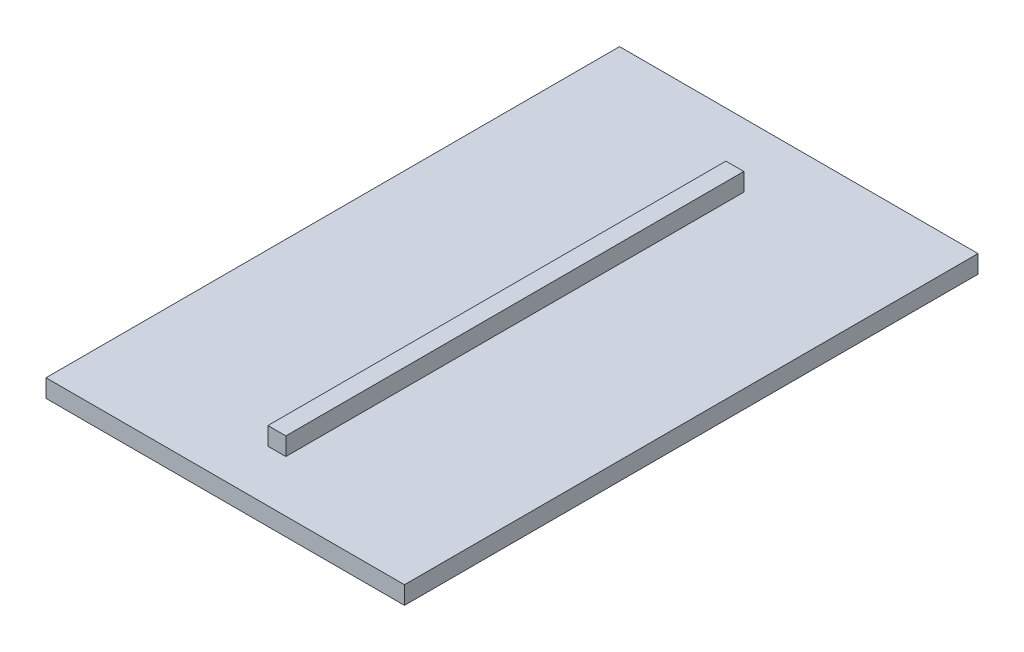
ISO-10303-21;
HEADER;
FILE_DESCRIPTION(('STEP AP214'),'2;1');
FILE_NAME('part.step','',(''),(''),'','','');
FILE_SCHEMA(('AUTOMOTIVE_DESIGN { 1 0 10303 214 1 1 1 1 }'));
ENDSEC;
DATA;
#1=APPLICATION_CONTEXT('core data for automotive mechanical design processes');
#2=APPLICATION_PROTOCOL_DEFINITION('international standard','automotive_design',2000,#1);
#3=PRODUCT_CONTEXT('',#1,'mechanical');
#4=PRODUCT('Part','Part','',(#3));
#5=PRODUCT_RELATED_PRODUCT_CATEGORY('part','',(#4));
#6=PRODUCT_DEFINITION_FORMATION('','',#4);
#7=PRODUCT_DEFINITION_CONTEXT('part definition',#1,'design');
#8=PRODUCT_DEFINITION('design','',#6,#7);
#9=PRODUCT_DEFINITION_SHAPE('','',#8);
#10=(LENGTH_UNIT() NAMED_UNIT(*) SI_UNIT(.MILLI.,.METRE.));
#11=(NAMED_UNIT(*) PLANE_ANGLE_UNIT() SI_UNIT($,.RADIAN.));
#12=(NAMED_UNIT(*) SI_UNIT($,.STERADIAN.) SOLID_ANGLE_UNIT());
#13=UNCERTAINTY_MEASURE_WITH_UNIT(LENGTH_MEASURE(1.E-05),#10,'distance_accuracy_value','');
#14=(GEOMETRIC_REPRESENTATION_CONTEXT(3) GLOBAL_UNCERTAINTY_ASSIGNED_CONTEXT((#13)) GLOBAL_UNIT_ASSIGNED_CONTEXT((#10,
#11,#12)) REPRESENTATION_CONTEXT('',''));
#15=CARTESIAN_POINT('',(0.,0.,0.));
#16=DIRECTION('',(0.,0.,1.));
#17=DIRECTION('',(1.,0.,0.));
#18=AXIS2_PLACEMENT_3D('',#15,#16,#17);
#19=CARTESIAN_POINT('',(0.,0.5,0.));
#20=DIRECTION('',(0.,1.,0.));
#21=DIRECTION('',(0.,0.,1.));
#22=AXIS2_PLACEMENT_3D('',#19,#20,#21);
#23=PLANE('',#22);
#24=DIRECTION('',(0.,0.,-1.));
#25=VECTOR('',#24,1.);
#26=CARTESIAN_POINT('',(5.,0.5,-8.));
#27=LINE('',#26,#25);
#28=CARTESIAN_POINT('',(5.,0.5,8.));
#29=VERTEX_POINT('',#28);
#30=CARTESIAN_POINT('',(5.,0.5,-8.));
#31=VERTEX_POINT('',#30);
#32=EDGE_CURVE('E142',#29,#31,#27,.T.);
#33=ORIENTED_EDGE('',*,*,#32,.T.);
#34=DIRECTION('',(-1.,0.,0.));
#35=VECTOR('',#34,1.);
#36=CARTESIAN_POINT('',(-5.,0.5,-8.));
#37=LINE('',#36,#35);
#38=CARTESIAN_POINT('',(-5.,0.5,-8.));
#39=VERTEX_POINT('',#38);
#40=EDGE_CURVE('E87',#31,#39,#37,.T.);
#41=ORIENTED_EDGE('',*,*,#40,.T.);
#42=DIRECTION('',(0.,0.,1.));
#43=VECTOR('',#42,1.);
#44=CARTESIAN_POINT('',(-5.,0.5,-8.));
#45=LINE('',#44,#43);
#46=CARTESIAN_POINT('',(-5.,0.5,8.));
#47=VERTEX_POINT('',#46);
#48=EDGE_CURVE('E145',#39,#47,#45,.T.);
#49=ORIENTED_EDGE('',*,*,#48,.T.);
#50=DIRECTION('',(1.,0.,0.));
#51=VECTOR('',#50,1.);
#52=CARTESIAN_POINT('',(-5.,0.5,8.));
#53=LINE('',#52,#51);
#54=EDGE_CURVE('E59',#47,#29,#53,.T.);
#55=ORIENTED_EDGE('',*,*,#54,.T.);
#56=EDGE_LOOP('',(#33,#41,#49,#55));
#57=FACE_BOUND('',#56,.T.);
#58=DIRECTION('',(-1.,0.,0.));
#59=VECTOR('',#58,1.);
#60=CARTESIAN_POINT('',(-0.250000000000001,0.5,-6.21728312292191));
#61=LINE('',#60,#59);
#62=CARTESIAN_POINT('',(0.249999999999999,0.5,-6.21728312292191));
#63=VERTEX_POINT('',#62);
#64=CARTESIAN_POINT('',(-0.250000000000001,0.5,-6.21728312292191));
#65=VERTEX_POINT('',#64);
#66=EDGE_CURVE('E265',#63,#65,#61,.T.);
#67=ORIENTED_EDGE('',*,*,#66,.F.);
#68=DIRECTION('',(0.,0.,-1.));
#69=VECTOR('',#68,1.);
#70=CARTESIAN_POINT('',(0.249999999999999,0.5,-6.21728312292191));
#71=LINE('',#70,#69);
#72=CARTESIAN_POINT('',(0.250000000000001,0.5,6.55913442902545));
#73=VERTEX_POINT('',#72);
#74=EDGE_CURVE('E132',#73,#63,#71,.T.);
#75=ORIENTED_EDGE('',*,*,#74,.F.);
#76=DIRECTION('',(1.,0.,0.));
#77=VECTOR('',#76,1.);
#78=CARTESIAN_POINT('',(-0.249999999999999,0.5,6.55913442902545));
#79=LINE('',#78,#77);
#80=CARTESIAN_POINT('',(-0.249999999999999,0.5,6.55913442902545));
#81=VERTEX_POINT('',#80);
#82=EDGE_CURVE('E128',#81,#73,#79,.T.);
#83=ORIENTED_EDGE('',*,*,#82,.F.);
#84=DIRECTION('',(0.,0.,1.));
#85=VECTOR('',#84,1.);
#86=CARTESIAN_POINT('',(-0.250000000000001,0.5,-6.21728312292191));
#87=LINE('',#86,#85);
#88=EDGE_CURVE('E262',#65,#81,#87,.T.);
#89=ORIENTED_EDGE('',*,*,#88,.F.);
#90=EDGE_LOOP('',(#67,#75,#83,#89));
#91=FACE_BOUND('',#90,.T.);
#92=ADVANCED_FACE('F35',(#57,#91),#23,.T.);
#93=CARTESIAN_POINT('',(5.,0.5,-8.));
#94=DIRECTION('',(-1.,0.,0.));
#95=DIRECTION('',(0.,0.,1.));
#96=AXIS2_PLACEMENT_3D('',#93,#94,#95);
#97=PLANE('',#96);
#98=DIRECTION('',(0.,0.,-1.));
#99=VECTOR('',#98,1.);
#100=CARTESIAN_POINT('',(5.,0.,-8.));
#101=LINE('',#100,#99);
#102=CARTESIAN_POINT('',(5.,0.,8.));
#103=VERTEX_POINT('',#102);
#104=CARTESIAN_POINT('',(5.,0.,-8.));
#105=VERTEX_POINT('',#104);
#106=EDGE_CURVE('E134',#103,#105,#101,.T.);
#107=ORIENTED_EDGE('',*,*,#106,.T.);
#108=DIRECTION('',(0.,-1.,0.));
#109=VECTOR('',#108,1.);
#110=CARTESIAN_POINT('',(5.,0.5,-8.));
#111=LINE('',#110,#109);
#112=EDGE_CURVE('E11',#31,#105,#111,.T.);
#113=ORIENTED_EDGE('',*,*,#112,.F.);
#114=ORIENTED_EDGE('',*,*,#32,.F.);
#115=DIRECTION('',(0.,-1.,0.));
#116=VECTOR('',#115,1.);
#117=CARTESIAN_POINT('',(5.,0.5,8.));
#118=LINE('',#117,#116);
#119=EDGE_CURVE('E147',#29,#103,#118,.T.);
#120=ORIENTED_EDGE('',*,*,#119,.T.);
#121=EDGE_LOOP('',(#107,#113,#114,#120));
#122=FACE_BOUND('',#121,.T.);
#123=ADVANCED_FACE('F37',(#122),#97,.F.);
#124=CARTESIAN_POINT('',(-5.,0.5,-8.));
#125=DIRECTION('',(0.,0.,1.));
#126=DIRECTION('',(1.,0.,0.));
#127=AXIS2_PLACEMENT_3D('',#124,#125,#126);
#128=PLANE('',#127);
#129=DIRECTION('',(-1.,0.,0.));
#130=VECTOR('',#129,1.);
#131=CARTESIAN_POINT('',(-5.,0.,-8.));
#132=LINE('',#131,#130);
#133=CARTESIAN_POINT('',(-5.,0.,-8.));
#134=VERTEX_POINT('',#133);
#135=EDGE_CURVE('E137',#105,#134,#132,.T.);
#136=ORIENTED_EDGE('',*,*,#135,.T.);
#137=DIRECTION('',(0.,-1.,0.));
#138=VECTOR('',#137,1.);
#139=CARTESIAN_POINT('',(-5.,0.5,-8.));
#140=LINE('',#139,#138);
#141=EDGE_CURVE('E43',#39,#134,#140,.T.);
#142=ORIENTED_EDGE('',*,*,#141,.F.);
#143=ORIENTED_EDGE('',*,*,#40,.F.);
#144=ORIENTED_EDGE('',*,*,#112,.T.);
#145=EDGE_LOOP('',(#136,#142,#143,#144));
#146=FACE_BOUND('',#145,.T.);
#147=ADVANCED_FACE('F175',(#146),#128,.F.);
#148=CARTESIAN_POINT('',(-5.,0.5,-8.));
#149=DIRECTION('',(1.,0.,0.));
#150=DIRECTION('',(0.,0.,-1.));
#151=AXIS2_PLACEMENT_3D('',#148,#149,#150);
#152=PLANE('',#151);
#153=DIRECTION('',(0.,0.,1.));
#154=VECTOR('',#153,1.);
#155=CARTESIAN_POINT('',(-5.,0.,-8.));
#156=LINE('',#155,#154);
#157=CARTESIAN_POINT('',(-5.,0.,8.));
#158=VERTEX_POINT('',#157);
#159=EDGE_CURVE('E150',#134,#158,#156,.T.);
#160=ORIENTED_EDGE('',*,*,#159,.T.);
#161=DIRECTION('',(0.,-1.,0.));
#162=VECTOR('',#161,1.);
#163=CARTESIAN_POINT('',(-5.,0.5,8.));
#164=LINE('',#163,#162);
#165=EDGE_CURVE('E154',#47,#158,#164,.T.);
#166=ORIENTED_EDGE('',*,*,#165,.F.);
#167=ORIENTED_EDGE('',*,*,#48,.F.);
#168=ORIENTED_EDGE('',*,*,#141,.T.);
#169=EDGE_LOOP('',(#160,#166,#167,#168));
#170=FACE_BOUND('',#169,.T.);
#171=ADVANCED_FACE('F159',(#170),#152,.F.);
#172=CARTESIAN_POINT('',(-5.,0.5,8.));
#173=DIRECTION('',(0.,0.,-1.));
#174=DIRECTION('',(-1.,0.,0.));
#175=AXIS2_PLACEMENT_3D('',#172,#173,#174);
#176=PLANE('',#175);
#177=DIRECTION('',(1.,0.,0.));
#178=VECTOR('',#177,1.);
#179=CARTESIAN_POINT('',(-5.,0.,8.));
#180=LINE('',#179,#178);
#181=EDGE_CURVE('E80',#158,#103,#180,.T.);
#182=ORIENTED_EDGE('',*,*,#181,.T.);
#183=ORIENTED_EDGE('',*,*,#119,.F.);
#184=ORIENTED_EDGE('',*,*,#54,.F.);
#185=ORIENTED_EDGE('',*,*,#165,.T.);
#186=EDGE_LOOP('',(#182,#183,#184,#185));
#187=FACE_BOUND('',#186,.T.);
#188=ADVANCED_FACE('F167',(#187),#176,.F.);
#189=CARTESIAN_POINT('',(0.,0.,0.));
#190=DIRECTION('',(0.,1.,0.));
#191=DIRECTION('',(0.,0.,1.));
#192=AXIS2_PLACEMENT_3D('',#189,#190,#191);
#193=PLANE('',#192);
#194=ORIENTED_EDGE('',*,*,#106,.F.);
#195=ORIENTED_EDGE('',*,*,#181,.F.);
#196=ORIENTED_EDGE('',*,*,#159,.F.);
#197=ORIENTED_EDGE('',*,*,#135,.F.);
#198=EDGE_LOOP('',(#194,#195,#196,#197));
#199=FACE_BOUND('',#198,.T.);
#200=ADVANCED_FACE('F163',(#199),#193,.F.);
#201=CARTESIAN_POINT('',(0.249999999999999,1.,-6.21728312292191));
#202=DIRECTION('',(-1.,0.,0.));
#203=DIRECTION('',(0.,0.,1.));
#204=AXIS2_PLACEMENT_3D('',#201,#202,#203);
#205=PLANE('',#204);
#206=ORIENTED_EDGE('',*,*,#74,.T.);
#207=DIRECTION('',(0.,-1.,0.));
#208=VECTOR('',#207,1.);
#209=CARTESIAN_POINT('',(0.249999999999999,1.,-6.21728312292191));
#210=LINE('',#209,#208);
#211=CARTESIAN_POINT('',(0.249999999999999,1.,-6.21728312292191));
#212=VERTEX_POINT('',#211);
#213=EDGE_CURVE('E113',#212,#63,#210,.T.);
#214=ORIENTED_EDGE('',*,*,#213,.F.);
#215=DIRECTION('',(0.,0.,-1.));
#216=VECTOR('',#215,1.);
#217=CARTESIAN_POINT('',(0.249999999999999,1.,-6.21728312292191));
#218=LINE('',#217,#216);
#219=CARTESIAN_POINT('',(0.250000000000001,1.,6.55913442902545));
#220=VERTEX_POINT('',#219);
#221=EDGE_CURVE('E120',#220,#212,#218,.T.);
#222=ORIENTED_EDGE('',*,*,#221,.F.);
#223=DIRECTION('',(0.,-1.,0.));
#224=VECTOR('',#223,1.);
#225=CARTESIAN_POINT('',(0.250000000000001,1.,6.55913442902545));
#226=LINE('',#225,#224);
#227=EDGE_CURVE('E260',#220,#73,#226,.T.);
#228=ORIENTED_EDGE('',*,*,#227,.T.);
#229=EDGE_LOOP('',(#206,#214,#222,#228));
#230=FACE_BOUND('',#229,.T.);
#231=ADVANCED_FACE('F130',(#230),#205,.F.);
#232=CARTESIAN_POINT('',(-0.250000000000001,1.,-6.21728312292191));
#233=DIRECTION('',(0.,0.,1.));
#234=DIRECTION('',(1.,0.,0.));
#235=AXIS2_PLACEMENT_3D('',#232,#233,#234);
#236=PLANE('',#235);
#237=ORIENTED_EDGE('',*,*,#66,.T.);
#238=DIRECTION('',(0.,-1.,0.));
#239=VECTOR('',#238,1.);
#240=CARTESIAN_POINT('',(-0.250000000000001,1.,-6.21728312292191));
#241=LINE('',#240,#239);
#242=CARTESIAN_POINT('',(-0.250000000000001,1.,-6.21728312292191));
#243=VERTEX_POINT('',#242);
#244=EDGE_CURVE('E116',#243,#65,#241,.T.);
#245=ORIENTED_EDGE('',*,*,#244,.F.);
#246=DIRECTION('',(-1.,0.,0.));
#247=VECTOR('',#246,1.);
#248=CARTESIAN_POINT('',(-0.250000000000001,1.,-6.21728312292191));
#249=LINE('',#248,#247);
#250=EDGE_CURVE('E109',#212,#243,#249,.T.);
#251=ORIENTED_EDGE('',*,*,#250,.F.);
#252=ORIENTED_EDGE('',*,*,#213,.T.);
#253=EDGE_LOOP('',(#237,#245,#251,#252));
#254=FACE_BOUND('',#253,.T.);
#255=ADVANCED_FACE('F111',(#254),#236,.F.);
#256=CARTESIAN_POINT('',(-0.250000000000001,1.,-6.21728312292191));
#257=DIRECTION('',(1.,0.,0.));
#258=DIRECTION('',(0.,0.,-1.));
#259=AXIS2_PLACEMENT_3D('',#256,#257,#258);
#260=PLANE('',#259);
#261=ORIENTED_EDGE('',*,*,#88,.T.);
#262=DIRECTION('',(0.,-1.,0.));
#263=VECTOR('',#262,1.);
#264=CARTESIAN_POINT('',(-0.249999999999999,1.,6.55913442902545));
#265=LINE('',#264,#263);
#266=CARTESIAN_POINT('',(-0.249999999999999,1.,6.55913442902545));
#267=VERTEX_POINT('',#266);
#268=EDGE_CURVE('E50',#267,#81,#265,.T.);
#269=ORIENTED_EDGE('',*,*,#268,.F.);
#270=DIRECTION('',(0.,0.,1.));
#271=VECTOR('',#270,1.);
#272=CARTESIAN_POINT('',(-0.250000000000001,1.,-6.21728312292191));
#273=LINE('',#272,#271);
#274=EDGE_CURVE('E119',#243,#267,#273,.T.);
#275=ORIENTED_EDGE('',*,*,#274,.F.);
#276=ORIENTED_EDGE('',*,*,#244,.T.);
#277=EDGE_LOOP('',(#261,#269,#275,#276));
#278=FACE_BOUND('',#277,.T.);
#279=ADVANCED_FACE('F188',(#278),#260,.F.);
#280=CARTESIAN_POINT('',(-0.249999999999999,1.,6.55913442902545));
#281=DIRECTION('',(0.,0.,-1.));
#282=DIRECTION('',(-1.,0.,0.));
#283=AXIS2_PLACEMENT_3D('',#280,#281,#282);
#284=PLANE('',#283);
#285=ORIENTED_EDGE('',*,*,#82,.T.);
#286=ORIENTED_EDGE('',*,*,#227,.F.);
#287=DIRECTION('',(1.,0.,0.));
#288=VECTOR('',#287,1.);
#289=CARTESIAN_POINT('',(-0.249999999999999,1.,6.55913442902545));
#290=LINE('',#289,#288);
#291=EDGE_CURVE('E124',#267,#220,#290,.T.);
#292=ORIENTED_EDGE('',*,*,#291,.F.);
#293=ORIENTED_EDGE('',*,*,#268,.T.);
#294=EDGE_LOOP('',(#285,#286,#292,#293));
#295=FACE_BOUND('',#294,.T.);
#296=ADVANCED_FACE('F191',(#295),#284,.F.);
#297=CARTESIAN_POINT('',(0.,1.,0.));
#298=DIRECTION('',(0.,1.,0.));
#299=DIRECTION('',(0.,0.,1.));
#300=AXIS2_PLACEMENT_3D('',#297,#298,#299);
#301=PLANE('',#300);
#302=ORIENTED_EDGE('',*,*,#221,.T.);
#303=ORIENTED_EDGE('',*,*,#250,.T.);
#304=ORIENTED_EDGE('',*,*,#274,.T.);
#305=ORIENTED_EDGE('',*,*,#291,.T.);
#306=EDGE_LOOP('',(#302,#303,#304,#305));
#307=FACE_BOUND('',#306,.T.);
#308=ADVANCED_FACE('F123',(#307),#301,.T.);
#309=CLOSED_SHELL('',(#92,#123,#147,#171,#188,#200,#231,#255,#279,#296,#308));
#310=MANIFOLD_SOLID_BREP('B2',#309);
#311=ADVANCED_BREP_SHAPE_REPRESENTATION('',(#18,#310),#14);
#312=SHAPE_DEFINITION_REPRESENTATION(#9,#311);
ENDSEC;
END-ISO-10303-21;
